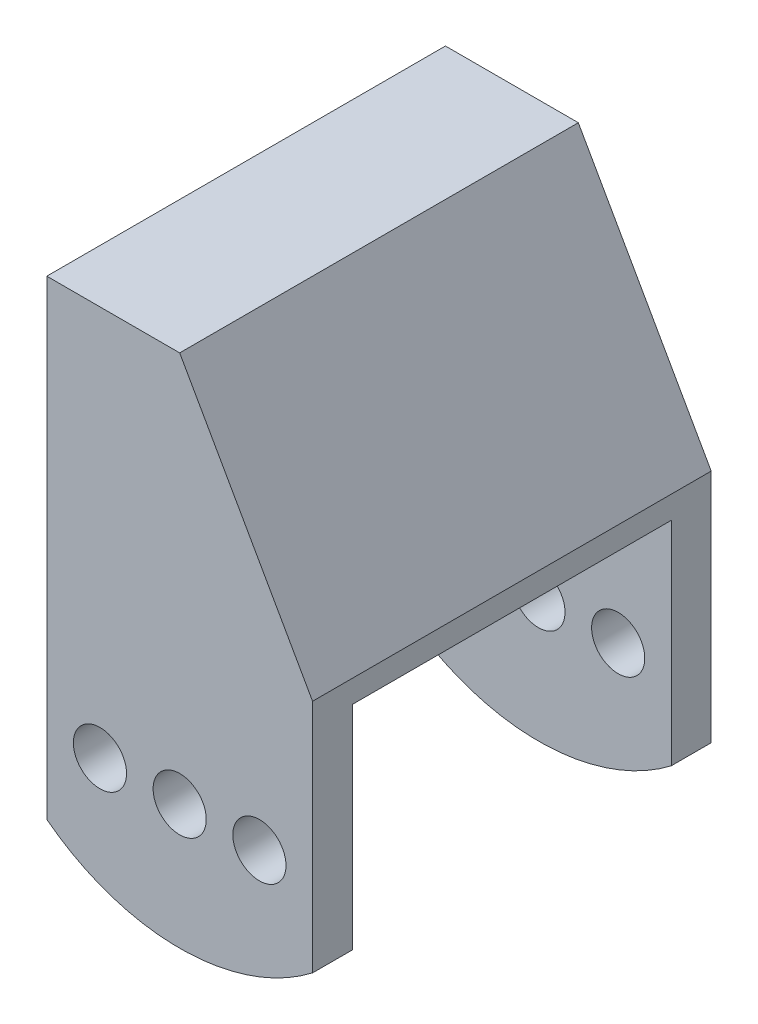
ISO-10303-21;
HEADER;
FILE_DESCRIPTION(('STEP AP214'),'2;1');
FILE_NAME('part.step','',(''),(''),'','','');
FILE_SCHEMA(('AUTOMOTIVE_DESIGN { 1 0 10303 214 1 1 1 1 }'));
ENDSEC;
DATA;
#1=APPLICATION_CONTEXT('core data for automotive mechanical design processes');
#2=APPLICATION_PROTOCOL_DEFINITION('international standard','automotive_design',2000,#1);
#3=PRODUCT_CONTEXT('',#1,'mechanical');
#4=PRODUCT('Part','Part','',(#3));
#5=PRODUCT_RELATED_PRODUCT_CATEGORY('part','',(#4));
#6=PRODUCT_DEFINITION_FORMATION('','',#4);
#7=PRODUCT_DEFINITION_CONTEXT('part definition',#1,'design');
#8=PRODUCT_DEFINITION('design','',#6,#7);
#9=PRODUCT_DEFINITION_SHAPE('','',#8);
#10=(LENGTH_UNIT() NAMED_UNIT(*) SI_UNIT(.MILLI.,.METRE.));
#11=(NAMED_UNIT(*) PLANE_ANGLE_UNIT() SI_UNIT($,.RADIAN.));
#12=(NAMED_UNIT(*) SI_UNIT($,.STERADIAN.) SOLID_ANGLE_UNIT());
#13=UNCERTAINTY_MEASURE_WITH_UNIT(LENGTH_MEASURE(1.E-05),#10,'distance_accuracy_value','');
#14=(GEOMETRIC_REPRESENTATION_CONTEXT(3) GLOBAL_UNCERTAINTY_ASSIGNED_CONTEXT((#13)) GLOBAL_UNIT_ASSIGNED_CONTEXT((#10,
#11,#12)) REPRESENTATION_CONTEXT('',''));
#15=CARTESIAN_POINT('',(0.,0.,0.));
#16=DIRECTION('',(0.,0.,1.));
#17=DIRECTION('',(1.,0.,0.));
#18=AXIS2_PLACEMENT_3D('',#15,#16,#17);
#19=CARTESIAN_POINT('',(0.,0.,30.));
#20=DIRECTION('',(0.,0.,-1.));
#21=DIRECTION('',(-1.,0.,0.));
#22=AXIS2_PLACEMENT_3D('',#19,#20,#21);
#23=CYLINDRICAL_SURFACE('',#22,16.4267963170458);
#24=DIRECTION('',(0.,0.,-1.));
#25=VECTOR('',#24,1.);
#26=CARTESIAN_POINT('',(10.,-13.032253728412,30.));
#27=LINE('',#26,#25);
#28=CARTESIAN_POINT('',(10.,-13.032253728412,3.));
#29=VERTEX_POINT('',#28);
#30=CARTESIAN_POINT('',(10.,-13.032253728412,0.));
#31=VERTEX_POINT('',#30);
#32=EDGE_CURVE('E144',#29,#31,#27,.T.);
#33=ORIENTED_EDGE('',*,*,#32,.F.);
#34=CARTESIAN_POINT('',(0.,0.,3.));
#35=DIRECTION('',(0.,0.,-1.));
#36=DIRECTION('',(-1.,0.,0.));
#37=AXIS2_PLACEMENT_3D('',#34,#35,#36);
#38=CIRCLE('',#37,16.4267963170458);
#39=CARTESIAN_POINT('',(-10.,-13.032253728412,3.));
#40=VERTEX_POINT('',#39);
#41=EDGE_CURVE('E54',#29,#40,#38,.T.);
#42=ORIENTED_EDGE('',*,*,#41,.T.);
#43=DIRECTION('',(0.,0.,-1.));
#44=VECTOR('',#43,1.);
#45=CARTESIAN_POINT('',(-10.,-13.032253728412,30.));
#46=LINE('',#45,#44);
#47=CARTESIAN_POINT('',(-10.,-13.032253728412,0.));
#48=VERTEX_POINT('',#47);
#49=EDGE_CURVE('E119',#40,#48,#46,.T.);
#50=ORIENTED_EDGE('',*,*,#49,.T.);
#51=CARTESIAN_POINT('',(0.,0.,0.));
#52=DIRECTION('',(0.,0.,1.));
#53=DIRECTION('',(1.,0.,0.));
#54=AXIS2_PLACEMENT_3D('',#51,#52,#53);
#55=CIRCLE('',#54,16.4267963170458);
#56=EDGE_CURVE('E138',#48,#31,#55,.T.);
#57=ORIENTED_EDGE('',*,*,#56,.T.);
#58=EDGE_LOOP('',(#33,#42,#50,#57));
#59=FACE_BOUND('',#58,.T.);
#60=ADVANCED_FACE('F37',(#59),#23,.T.);
#61=CARTESIAN_POINT('',(0.,-7.03225372841202,30.));
#62=DIRECTION('',(0.,0.,-1.));
#63=DIRECTION('',(-1.,0.,0.));
#64=AXIS2_PLACEMENT_3D('',#61,#62,#63);
#65=CYLINDRICAL_SURFACE('',#64,2.);
#66=CARTESIAN_POINT('',(0.,-7.03225372841202,27.));
#67=DIRECTION('',(0.,0.,1.));
#68=DIRECTION('',(1.,0.,0.));
#69=AXIS2_PLACEMENT_3D('',#66,#67,#68);
#70=CIRCLE('',#69,2.);
#71=CARTESIAN_POINT('',(2.,-7.03225372841202,27.));
#72=VERTEX_POINT('',#71);
#73=EDGE_CURVE('E176',#72,#72,#70,.T.);
#74=ORIENTED_EDGE('',*,*,#73,.F.);
#75=EDGE_LOOP('',(#74));
#76=FACE_BOUND('',#75,.T.);
#77=CARTESIAN_POINT('',(0.,-7.03225372841202,30.));
#78=DIRECTION('',(0.,0.,1.));
#79=DIRECTION('',(1.,0.,0.));
#80=AXIS2_PLACEMENT_3D('',#77,#78,#79);
#81=CIRCLE('',#80,2.);
#82=CARTESIAN_POINT('',(2.,-7.03225372841202,30.));
#83=VERTEX_POINT('',#82);
#84=EDGE_CURVE('E133',#83,#83,#81,.T.);
#85=ORIENTED_EDGE('',*,*,#84,.T.);
#86=EDGE_LOOP('',(#85));
#87=FACE_BOUND('',#86,.T.);
#88=ADVANCED_FACE('F307',(#76,#87),#65,.F.);
#89=CARTESIAN_POINT('',(6.,-7.03225372841202,30.));
#90=DIRECTION('',(0.,0.,-1.));
#91=DIRECTION('',(-1.,0.,0.));
#92=AXIS2_PLACEMENT_3D('',#89,#90,#91);
#93=CYLINDRICAL_SURFACE('',#92,2.);
#94=CARTESIAN_POINT('',(6.,-7.03225372841202,27.));
#95=DIRECTION('',(0.,0.,1.));
#96=DIRECTION('',(1.,0.,0.));
#97=AXIS2_PLACEMENT_3D('',#94,#95,#96);
#98=CIRCLE('',#97,2.);
#99=CARTESIAN_POINT('',(8.,-7.03225372841202,27.));
#100=VERTEX_POINT('',#99);
#101=EDGE_CURVE('E173',#100,#100,#98,.T.);
#102=ORIENTED_EDGE('',*,*,#101,.F.);
#103=EDGE_LOOP('',(#102));
#104=FACE_BOUND('',#103,.T.);
#105=CARTESIAN_POINT('',(6.,-7.03225372841202,30.));
#106=DIRECTION('',(0.,0.,1.));
#107=DIRECTION('',(1.,0.,0.));
#108=AXIS2_PLACEMENT_3D('',#105,#106,#107);
#109=CIRCLE('',#108,2.);
#110=CARTESIAN_POINT('',(8.,-7.03225372841202,30.));
#111=VERTEX_POINT('',#110);
#112=EDGE_CURVE('E188',#111,#111,#109,.T.);
#113=ORIENTED_EDGE('',*,*,#112,.T.);
#114=EDGE_LOOP('',(#113));
#115=FACE_BOUND('',#114,.T.);
#116=ADVANCED_FACE('F311',(#104,#115),#93,.F.);
#117=CARTESIAN_POINT('',(-6.,-7.03225372841202,30.));
#118=DIRECTION('',(0.,0.,-1.));
#119=DIRECTION('',(-1.,0.,0.));
#120=AXIS2_PLACEMENT_3D('',#117,#118,#119);
#121=CYLINDRICAL_SURFACE('',#120,2.);
#122=CARTESIAN_POINT('',(-6.,-7.03225372841202,27.));
#123=DIRECTION('',(0.,0.,1.));
#124=DIRECTION('',(1.,0.,0.));
#125=AXIS2_PLACEMENT_3D('',#122,#123,#124);
#126=CIRCLE('',#125,2.);
#127=CARTESIAN_POINT('',(-4.,-7.03225372841202,27.));
#128=VERTEX_POINT('',#127);
#129=EDGE_CURVE('E41',#128,#128,#126,.T.);
#130=ORIENTED_EDGE('',*,*,#129,.F.);
#131=EDGE_LOOP('',(#130));
#132=FACE_BOUND('',#131,.T.);
#133=CARTESIAN_POINT('',(-6.,-7.03225372841202,30.));
#134=DIRECTION('',(0.,0.,1.));
#135=DIRECTION('',(1.,0.,0.));
#136=AXIS2_PLACEMENT_3D('',#133,#134,#135);
#137=CIRCLE('',#136,2.);
#138=CARTESIAN_POINT('',(-4.,-7.03225372841202,30.));
#139=VERTEX_POINT('',#138);
#140=EDGE_CURVE('E182',#139,#139,#137,.T.);
#141=ORIENTED_EDGE('',*,*,#140,.T.);
#142=EDGE_LOOP('',(#141));
#143=FACE_BOUND('',#142,.T.);
#144=ADVANCED_FACE('F321',(#132,#143),#121,.F.);
#145=CARTESIAN_POINT('',(0.,0.,30.));
#146=DIRECTION('',(0.,0.,1.));
#147=DIRECTION('',(1.,0.,0.));
#148=AXIS2_PLACEMENT_3D('',#145,#146,#147);
#149=PLANE('',#148);
#150=ORIENTED_EDGE('',*,*,#112,.F.);
#151=EDGE_LOOP('',(#150));
#152=FACE_BOUND('',#151,.T.);
#153=DIRECTION('',(-0.491789849149758,0.870713927919646,0.));
#154=VECTOR('',#153,1.);
#155=CARTESIAN_POINT('',(0.,22.377746271588,30.));
#156=LINE('',#155,#154);
#157=CARTESIAN_POINT('',(10.,4.67274627158798,30.));
#158=VERTEX_POINT('',#157);
#159=CARTESIAN_POINT('',(0.,22.377746271588,30.));
#160=VERTEX_POINT('',#159);
#161=EDGE_CURVE('E142',#158,#160,#156,.T.);
#162=ORIENTED_EDGE('',*,*,#161,.T.);
#163=DIRECTION('',(-1.,0.,0.));
#164=VECTOR('',#163,1.);
#165=CARTESIAN_POINT('',(-10.,22.377746271588,30.));
#166=LINE('',#165,#164);
#167=CARTESIAN_POINT('',(-10.,22.377746271588,30.));
#168=VERTEX_POINT('',#167);
#169=EDGE_CURVE('E94',#160,#168,#166,.T.);
#170=ORIENTED_EDGE('',*,*,#169,.T.);
#171=DIRECTION('',(0.,-1.,0.));
#172=VECTOR('',#171,1.);
#173=CARTESIAN_POINT('',(-10.,-13.032253728412,30.));
#174=LINE('',#173,#172);
#175=CARTESIAN_POINT('',(-10.,-13.032253728412,30.));
#176=VERTEX_POINT('',#175);
#177=EDGE_CURVE('E100',#168,#176,#174,.T.);
#178=ORIENTED_EDGE('',*,*,#177,.T.);
#179=CARTESIAN_POINT('',(0.,0.,30.));
#180=DIRECTION('',(0.,0.,1.));
#181=DIRECTION('',(1.,0.,0.));
#182=AXIS2_PLACEMENT_3D('',#179,#180,#181);
#183=CIRCLE('',#182,16.4267963170458);
#184=CARTESIAN_POINT('',(10.,-13.032253728412,30.));
#185=VERTEX_POINT('',#184);
#186=EDGE_CURVE('E105',#176,#185,#183,.T.);
#187=ORIENTED_EDGE('',*,*,#186,.T.);
#188=DIRECTION('',(0.,1.,0.));
#189=VECTOR('',#188,1.);
#190=CARTESIAN_POINT('',(10.,4.67274627158798,30.));
#191=LINE('',#190,#189);
#192=EDGE_CURVE('E63',#185,#158,#191,.T.);
#193=ORIENTED_EDGE('',*,*,#192,.T.);
#194=EDGE_LOOP('',(#162,#170,#178,#187,#193));
#195=FACE_BOUND('',#194,.T.);
#196=ORIENTED_EDGE('',*,*,#84,.F.);
#197=EDGE_LOOP('',(#196));
#198=FACE_BOUND('',#197,.T.);
#199=ORIENTED_EDGE('',*,*,#140,.F.);
#200=EDGE_LOOP('',(#199));
#201=FACE_BOUND('',#200,.T.);
#202=ADVANCED_FACE('F102',(#152,#195,#198,#201),#149,.T.);
#203=CARTESIAN_POINT('',(0.,0.,0.));
#204=DIRECTION('',(0.,0.,1.));
#205=DIRECTION('',(1.,0.,0.));
#206=AXIS2_PLACEMENT_3D('',#203,#204,#205);
#207=PLANE('',#206);
#208=DIRECTION('',(-0.491789849149758,0.870713927919646,0.));
#209=VECTOR('',#208,1.);
#210=CARTESIAN_POINT('',(0.,22.377746271588,0.));
#211=LINE('',#210,#209);
#212=CARTESIAN_POINT('',(10.,4.67274627158798,0.));
#213=VERTEX_POINT('',#212);
#214=CARTESIAN_POINT('',(0.,22.377746271588,0.));
#215=VERTEX_POINT('',#214);
#216=EDGE_CURVE('E129',#213,#215,#211,.T.);
#217=ORIENTED_EDGE('',*,*,#216,.F.);
#218=DIRECTION('',(0.,1.,0.));
#219=VECTOR('',#218,1.);
#220=CARTESIAN_POINT('',(10.,4.67274627158798,0.));
#221=LINE('',#220,#219);
#222=EDGE_CURVE('E86',#31,#213,#221,.T.);
#223=ORIENTED_EDGE('',*,*,#222,.F.);
#224=ORIENTED_EDGE('',*,*,#56,.F.);
#225=DIRECTION('',(0.,-1.,0.));
#226=VECTOR('',#225,1.);
#227=CARTESIAN_POINT('',(-10.,-13.032253728412,0.));
#228=LINE('',#227,#226);
#229=CARTESIAN_POINT('',(-10.,22.377746271588,0.));
#230=VERTEX_POINT('',#229);
#231=EDGE_CURVE('E135',#230,#48,#228,.T.);
#232=ORIENTED_EDGE('',*,*,#231,.F.);
#233=DIRECTION('',(-1.,0.,0.));
#234=VECTOR('',#233,1.);
#235=CARTESIAN_POINT('',(-10.,22.377746271588,0.));
#236=LINE('',#235,#234);
#237=EDGE_CURVE('E132',#215,#230,#236,.T.);
#238=ORIENTED_EDGE('',*,*,#237,.F.);
#239=EDGE_LOOP('',(#217,#223,#224,#232,#238));
#240=FACE_BOUND('',#239,.T.);
#241=CARTESIAN_POINT('',(0.,-7.03225372841202,0.));
#242=DIRECTION('',(0.,0.,1.));
#243=DIRECTION('',(1.,0.,0.));
#244=AXIS2_PLACEMENT_3D('',#241,#242,#243);
#245=CIRCLE('',#244,2.);
#246=CARTESIAN_POINT('',(2.,-7.03225372841202,0.));
#247=VERTEX_POINT('',#246);
#248=EDGE_CURVE('E191',#247,#247,#245,.T.);
#249=ORIENTED_EDGE('',*,*,#248,.T.);
#250=EDGE_LOOP('',(#249));
#251=FACE_BOUND('',#250,.T.);
#252=CARTESIAN_POINT('',(6.,-7.03225372841202,0.));
#253=DIRECTION('',(0.,0.,1.));
#254=DIRECTION('',(1.,0.,0.));
#255=AXIS2_PLACEMENT_3D('',#252,#253,#254);
#256=CIRCLE('',#255,2.);
#257=CARTESIAN_POINT('',(8.,-7.03225372841202,0.));
#258=VERTEX_POINT('',#257);
#259=EDGE_CURVE('E185',#258,#258,#256,.T.);
#260=ORIENTED_EDGE('',*,*,#259,.T.);
#261=EDGE_LOOP('',(#260));
#262=FACE_BOUND('',#261,.T.);
#263=CARTESIAN_POINT('',(-6.,-7.03225372841202,0.));
#264=DIRECTION('',(0.,0.,1.));
#265=DIRECTION('',(1.,0.,0.));
#266=AXIS2_PLACEMENT_3D('',#263,#264,#265);
#267=CIRCLE('',#266,2.);
#268=CARTESIAN_POINT('',(-4.,-7.03225372841202,0.));
#269=VERTEX_POINT('',#268);
#270=EDGE_CURVE('E181',#269,#269,#267,.T.);
#271=ORIENTED_EDGE('',*,*,#270,.T.);
#272=EDGE_LOOP('',(#271));
#273=FACE_BOUND('',#272,.T.);
#274=ADVANCED_FACE('F207',(#240,#251,#262,#273),#207,.F.);
#275=CARTESIAN_POINT('',(0.,22.377746271588,30.));
#276=DIRECTION('',(-0.870713927919646,-0.491789849149758,0.));
#277=DIRECTION('',(0.491789849149758,-0.870713927919646,0.));
#278=AXIS2_PLACEMENT_3D('',#275,#276,#277);
#279=PLANE('',#278);
#280=ORIENTED_EDGE('',*,*,#216,.T.);
#281=DIRECTION('',(0.,0.,-1.));
#282=VECTOR('',#281,1.);
#283=CARTESIAN_POINT('',(0.,22.377746271588,30.));
#284=LINE('',#283,#282);
#285=EDGE_CURVE('E11',#160,#215,#284,.T.);
#286=ORIENTED_EDGE('',*,*,#285,.F.);
#287=ORIENTED_EDGE('',*,*,#161,.F.);
#288=DIRECTION('',(0.,0.,-1.));
#289=VECTOR('',#288,1.);
#290=CARTESIAN_POINT('',(10.,4.67274627158798,30.));
#291=LINE('',#290,#289);
#292=EDGE_CURVE('E125',#158,#213,#291,.T.);
#293=ORIENTED_EDGE('',*,*,#292,.T.);
#294=EDGE_LOOP('',(#280,#286,#287,#293));
#295=FACE_BOUND('',#294,.T.);
#296=ADVANCED_FACE('F39',(#295),#279,.F.);
#297=CARTESIAN_POINT('',(-10.,22.377746271588,30.));
#298=DIRECTION('',(0.,-1.,0.));
#299=DIRECTION('',(0.,0.,-1.));
#300=AXIS2_PLACEMENT_3D('',#297,#298,#299);
#301=PLANE('',#300);
#302=ORIENTED_EDGE('',*,*,#237,.T.);
#303=DIRECTION('',(0.,0.,-1.));
#304=VECTOR('',#303,1.);
#305=CARTESIAN_POINT('',(-10.,22.377746271588,30.));
#306=LINE('',#305,#304);
#307=EDGE_CURVE('E46',#168,#230,#306,.T.);
#308=ORIENTED_EDGE('',*,*,#307,.F.);
#309=ORIENTED_EDGE('',*,*,#169,.F.);
#310=ORIENTED_EDGE('',*,*,#285,.T.);
#311=EDGE_LOOP('',(#302,#308,#309,#310));
#312=FACE_BOUND('',#311,.T.);
#313=ADVANCED_FACE('F202',(#312),#301,.F.);
#314=CARTESIAN_POINT('',(-10.,-13.032253728412,30.));
#315=DIRECTION('',(1.,0.,0.));
#316=DIRECTION('',(0.,0.,-1.));
#317=AXIS2_PLACEMENT_3D('',#314,#315,#316);
#318=PLANE('',#317);
#319=CARTESIAN_POINT('',(-10.,12.967746271588,15.));
#320=DIRECTION('',(-1.,0.,0.));
#321=DIRECTION('',(0.,0.,1.));
#322=AXIS2_PLACEMENT_3D('',#319,#320,#321);
#323=CIRCLE('',#322,8.90000000000001);
#324=CARTESIAN_POINT('',(-10.,12.967746271588,23.9));
#325=VERTEX_POINT('',#324);
#326=EDGE_CURVE('E238',#325,#325,#323,.T.);
#327=ORIENTED_EDGE('',*,*,#326,.F.);
#328=EDGE_LOOP('',(#327));
#329=FACE_BOUND('',#328,.T.);
#330=DIRECTION('',(0.,0.,1.));
#331=VECTOR('',#330,1.);
#332=CARTESIAN_POINT('',(-10.,2.96774627158798,27.));
#333=LINE('',#332,#331);
#334=CARTESIAN_POINT('',(-10.,2.96774627158798,3.));
#335=VERTEX_POINT('',#334);
#336=CARTESIAN_POINT('',(-10.,2.96774627158798,27.));
#337=VERTEX_POINT('',#336);
#338=EDGE_CURVE('E164',#335,#337,#333,.T.);
#339=ORIENTED_EDGE('',*,*,#338,.T.);
#340=DIRECTION('',(0.,-1.,0.));
#341=VECTOR('',#340,1.);
#342=CARTESIAN_POINT('',(-10.,-16.4267963170458,27.));
#343=LINE('',#342,#341);
#344=CARTESIAN_POINT('',(-10.,-13.032253728412,27.));
#345=VERTEX_POINT('',#344);
#346=EDGE_CURVE('E116',#337,#345,#343,.T.);
#347=ORIENTED_EDGE('',*,*,#346,.T.);
#348=EDGE_CURVE('E112',#176,#345,#46,.T.);
#349=ORIENTED_EDGE('',*,*,#348,.F.);
#350=ORIENTED_EDGE('',*,*,#177,.F.);
#351=ORIENTED_EDGE('',*,*,#307,.T.);
#352=ORIENTED_EDGE('',*,*,#231,.T.);
#353=ORIENTED_EDGE('',*,*,#49,.F.);
#354=DIRECTION('',(0.,1.,0.));
#355=VECTOR('',#354,1.);
#356=CARTESIAN_POINT('',(-10.,-16.4267963170458,3.));
#357=LINE('',#356,#355);
#358=EDGE_CURVE('E214',#40,#335,#357,.T.);
#359=ORIENTED_EDGE('',*,*,#358,.T.);
#360=EDGE_LOOP('',(#339,#347,#349,#350,#351,#352,#353,#359));
#361=FACE_BOUND('',#360,.T.);
#362=ADVANCED_FACE('F114',(#329,#361),#318,.F.);
#363=ORIENTED_EDGE('',*,*,#348,.T.);
#364=CARTESIAN_POINT('',(0.,0.,27.));
#365=DIRECTION('',(0.,0.,1.));
#366=DIRECTION('',(1.,0.,0.));
#367=AXIS2_PLACEMENT_3D('',#364,#365,#366);
#368=CIRCLE('',#367,16.4267963170458);
#369=CARTESIAN_POINT('',(10.,-13.032253728412,27.));
#370=VERTEX_POINT('',#369);
#371=EDGE_CURVE('E179',#345,#370,#368,.T.);
#372=ORIENTED_EDGE('',*,*,#371,.T.);
#373=EDGE_CURVE('E123',#185,#370,#27,.T.);
#374=ORIENTED_EDGE('',*,*,#373,.F.);
#375=ORIENTED_EDGE('',*,*,#186,.F.);
#376=EDGE_LOOP('',(#363,#372,#374,#375));
#377=FACE_BOUND('',#376,.T.);
#378=ADVANCED_FACE('F121',(#377),#23,.T.);
#379=CARTESIAN_POINT('',(10.,4.67274627158798,30.));
#380=DIRECTION('',(-1.,0.,0.));
#381=DIRECTION('',(0.,0.,1.));
#382=AXIS2_PLACEMENT_3D('',#379,#380,#381);
#383=PLANE('',#382);
#384=ORIENTED_EDGE('',*,*,#373,.T.);
#385=DIRECTION('',(0.,-1.,0.));
#386=VECTOR('',#385,1.);
#387=CARTESIAN_POINT('',(10.,-16.4267963170458,27.));
#388=LINE('',#387,#386);
#389=CARTESIAN_POINT('',(10.,2.96774627158798,27.));
#390=VERTEX_POINT('',#389);
#391=EDGE_CURVE('E234',#390,#370,#388,.T.);
#392=ORIENTED_EDGE('',*,*,#391,.F.);
#393=DIRECTION('',(0.,0.,1.));
#394=VECTOR('',#393,1.);
#395=CARTESIAN_POINT('',(10.,2.96774627158798,27.));
#396=LINE('',#395,#394);
#397=CARTESIAN_POINT('',(10.,2.96774627158798,3.));
#398=VERTEX_POINT('',#397);
#399=EDGE_CURVE('E167',#398,#390,#396,.T.);
#400=ORIENTED_EDGE('',*,*,#399,.F.);
#401=DIRECTION('',(0.,1.,0.));
#402=VECTOR('',#401,1.);
#403=CARTESIAN_POINT('',(10.,-16.4267963170458,3.));
#404=LINE('',#403,#402);
#405=EDGE_CURVE('E226',#29,#398,#404,.T.);
#406=ORIENTED_EDGE('',*,*,#405,.F.);
#407=ORIENTED_EDGE('',*,*,#32,.T.);
#408=ORIENTED_EDGE('',*,*,#222,.T.);
#409=ORIENTED_EDGE('',*,*,#292,.F.);
#410=ORIENTED_EDGE('',*,*,#192,.F.);
#411=EDGE_LOOP('',(#384,#392,#400,#406,#407,#408,#409,#410));
#412=FACE_BOUND('',#411,.T.);
#413=ADVANCED_FACE('F298',(#412),#383,.F.);
#414=CARTESIAN_POINT('',(0.,-7.03225372841202,3.));
#415=DIRECTION('',(0.,0.,-1.));
#416=DIRECTION('',(-1.,0.,0.));
#417=AXIS2_PLACEMENT_3D('',#414,#415,#416);
#418=CIRCLE('',#417,2.);
#419=CARTESIAN_POINT('',(-2.,-7.03225372841202,3.));
#420=VERTEX_POINT('',#419);
#421=EDGE_CURVE('E153',#420,#420,#418,.T.);
#422=ORIENTED_EDGE('',*,*,#421,.F.);
#423=EDGE_LOOP('',(#422));
#424=FACE_BOUND('',#423,.T.);
#425=ORIENTED_EDGE('',*,*,#248,.F.);
#426=EDGE_LOOP('',(#425));
#427=FACE_BOUND('',#426,.T.);
#428=ADVANCED_FACE('F314',(#424,#427),#65,.F.);
#429=CARTESIAN_POINT('',(6.,-7.03225372841202,3.));
#430=DIRECTION('',(0.,0.,-1.));
#431=DIRECTION('',(-1.,0.,0.));
#432=AXIS2_PLACEMENT_3D('',#429,#430,#431);
#433=CIRCLE('',#432,2.);
#434=CARTESIAN_POINT('',(4.,-7.03225372841202,3.));
#435=VERTEX_POINT('',#434);
#436=EDGE_CURVE('E148',#435,#435,#433,.T.);
#437=ORIENTED_EDGE('',*,*,#436,.F.);
#438=EDGE_LOOP('',(#437));
#439=FACE_BOUND('',#438,.T.);
#440=ORIENTED_EDGE('',*,*,#259,.F.);
#441=EDGE_LOOP('',(#440));
#442=FACE_BOUND('',#441,.T.);
#443=ADVANCED_FACE('F325',(#439,#442),#93,.F.);
#444=CARTESIAN_POINT('',(-6.,-7.03225372841202,3.));
#445=DIRECTION('',(0.,0.,-1.));
#446=DIRECTION('',(-1.,0.,0.));
#447=AXIS2_PLACEMENT_3D('',#444,#445,#446);
#448=CIRCLE('',#447,2.);
#449=CARTESIAN_POINT('',(-8.,-7.03225372841202,3.));
#450=VERTEX_POINT('',#449);
#451=EDGE_CURVE('E146',#450,#450,#448,.T.);
#452=ORIENTED_EDGE('',*,*,#451,.F.);
#453=EDGE_LOOP('',(#452));
#454=FACE_BOUND('',#453,.T.);
#455=ORIENTED_EDGE('',*,*,#270,.F.);
#456=EDGE_LOOP('',(#455));
#457=FACE_BOUND('',#456,.T.);
#458=ADVANCED_FACE('F329',(#454,#457),#121,.F.);
#459=CARTESIAN_POINT('',(-10.,-16.4267963170458,27.));
#460=DIRECTION('',(0.,0.,1.));
#461=DIRECTION('',(1.,0.,0.));
#462=AXIS2_PLACEMENT_3D('',#459,#460,#461);
#463=PLANE('',#462);
#464=ORIENTED_EDGE('',*,*,#73,.T.);
#465=EDGE_LOOP('',(#464));
#466=FACE_BOUND('',#465,.T.);
#467=ORIENTED_EDGE('',*,*,#101,.T.);
#468=EDGE_LOOP('',(#467));
#469=FACE_BOUND('',#468,.T.);
#470=ORIENTED_EDGE('',*,*,#129,.T.);
#471=EDGE_LOOP('',(#470));
#472=FACE_BOUND('',#471,.T.);
#473=ORIENTED_EDGE('',*,*,#346,.F.);
#474=DIRECTION('',(1.,0.,0.));
#475=VECTOR('',#474,1.);
#476=CARTESIAN_POINT('',(-10.,2.96774627158798,27.));
#477=LINE('',#476,#475);
#478=EDGE_CURVE('E149',#337,#390,#477,.T.);
#479=ORIENTED_EDGE('',*,*,#478,.T.);
#480=ORIENTED_EDGE('',*,*,#391,.T.);
#481=ORIENTED_EDGE('',*,*,#371,.F.);
#482=EDGE_LOOP('',(#473,#479,#480,#481));
#483=FACE_BOUND('',#482,.T.);
#484=ADVANCED_FACE('F333',(#466,#469,#472,#483),#463,.F.);
#485=CARTESIAN_POINT('',(-10.,-16.4267963170458,3.));
#486=DIRECTION('',(0.,0.,-1.));
#487=DIRECTION('',(-1.,0.,0.));
#488=AXIS2_PLACEMENT_3D('',#485,#486,#487);
#489=PLANE('',#488);
#490=ORIENTED_EDGE('',*,*,#421,.T.);
#491=EDGE_LOOP('',(#490));
#492=FACE_BOUND('',#491,.T.);
#493=ORIENTED_EDGE('',*,*,#436,.T.);
#494=EDGE_LOOP('',(#493));
#495=FACE_BOUND('',#494,.T.);
#496=ORIENTED_EDGE('',*,*,#451,.T.);
#497=EDGE_LOOP('',(#496));
#498=FACE_BOUND('',#497,.T.);
#499=ORIENTED_EDGE('',*,*,#405,.T.);
#500=DIRECTION('',(1.,0.,0.));
#501=VECTOR('',#500,1.);
#502=CARTESIAN_POINT('',(-10.,2.96774627158798,3.));
#503=LINE('',#502,#501);
#504=EDGE_CURVE('E156',#335,#398,#503,.T.);
#505=ORIENTED_EDGE('',*,*,#504,.F.);
#506=ORIENTED_EDGE('',*,*,#358,.F.);
#507=ORIENTED_EDGE('',*,*,#41,.F.);
#508=EDGE_LOOP('',(#499,#505,#506,#507));
#509=FACE_BOUND('',#508,.T.);
#510=ADVANCED_FACE('F225',(#492,#495,#498,#509),#489,.F.);
#511=CARTESIAN_POINT('',(-10.,2.96774627158798,27.));
#512=DIRECTION('',(0.,1.,0.));
#513=DIRECTION('',(0.,0.,1.));
#514=AXIS2_PLACEMENT_3D('',#511,#512,#513);
#515=PLANE('',#514);
#516=ORIENTED_EDGE('',*,*,#399,.T.);
#517=ORIENTED_EDGE('',*,*,#478,.F.);
#518=ORIENTED_EDGE('',*,*,#338,.F.);
#519=ORIENTED_EDGE('',*,*,#504,.T.);
#520=EDGE_LOOP('',(#516,#517,#518,#519));
#521=FACE_BOUND('',#520,.T.);
#522=ADVANCED_FACE('F229',(#521),#515,.F.);
#523=CARTESIAN_POINT('',(-7.,12.967746271588,15.));
#524=DIRECTION('',(-1.,0.,0.));
#525=DIRECTION('',(0.,0.,1.));
#526=AXIS2_PLACEMENT_3D('',#523,#524,#525);
#527=CYLINDRICAL_SURFACE('',#526,8.90000000000001);
#528=CARTESIAN_POINT('',(-7.,12.967746271588,15.));
#529=DIRECTION('',(-1.,0.,0.));
#530=DIRECTION('',(0.,0.,1.));
#531=AXIS2_PLACEMENT_3D('',#528,#529,#530);
#532=CIRCLE('',#531,8.90000000000001);
#533=CARTESIAN_POINT('',(-7.,12.967746271588,23.9));
#534=VERTEX_POINT('',#533);
#535=EDGE_CURVE('E235',#534,#534,#532,.T.);
#536=ORIENTED_EDGE('',*,*,#535,.F.);
#537=EDGE_LOOP('',(#536));
#538=FACE_BOUND('',#537,.T.);
#539=ORIENTED_EDGE('',*,*,#326,.T.);
#540=EDGE_LOOP('',(#539));
#541=FACE_BOUND('',#540,.T.);
#542=ADVANCED_FACE('F275',(#538,#541),#527,.F.);
#543=CARTESIAN_POINT('',(-7.,12.967746271588,15.));
#544=DIRECTION('',(-1.,0.,0.));
#545=DIRECTION('',(0.,0.,1.));
#546=AXIS2_PLACEMENT_3D('',#543,#544,#545);
#547=PLANE('',#546);
#548=CARTESIAN_POINT('',(-7.,12.967746271588,21.));
#549=DIRECTION('',(-1.,0.,0.));
#550=DIRECTION('',(0.,0.,1.));
#551=AXIS2_PLACEMENT_3D('',#548,#549,#550);
#552=CIRCLE('',#551,2.);
#553=CARTESIAN_POINT('',(-7.,12.967746271588,23.));
#554=VERTEX_POINT('',#553);
#555=EDGE_CURVE('E259',#554,#554,#552,.T.);
#556=ORIENTED_EDGE('',*,*,#555,.F.);
#557=EDGE_LOOP('',(#556));
#558=FACE_BOUND('',#557,.T.);
#559=CARTESIAN_POINT('',(-7.,12.967746271588,9.));
#560=DIRECTION('',(-1.,0.,0.));
#561=DIRECTION('',(0.,0.,1.));
#562=AXIS2_PLACEMENT_3D('',#559,#560,#561);
#563=CIRCLE('',#562,2.);
#564=CARTESIAN_POINT('',(-7.,12.967746271588,11.));
#565=VERTEX_POINT('',#564);
#566=EDGE_CURVE('E253',#565,#565,#563,.T.);
#567=ORIENTED_EDGE('',*,*,#566,.F.);
#568=EDGE_LOOP('',(#567));
#569=FACE_BOUND('',#568,.T.);
#570=CARTESIAN_POINT('',(-7.,6.96774627158798,15.));
#571=DIRECTION('',(-1.,0.,0.));
#572=DIRECTION('',(0.,0.,1.));
#573=AXIS2_PLACEMENT_3D('',#570,#571,#572);
#574=CIRCLE('',#573,2.);
#575=CARTESIAN_POINT('',(-7.,6.96774627158798,17.));
#576=VERTEX_POINT('',#575);
#577=EDGE_CURVE('E247',#576,#576,#574,.T.);
#578=ORIENTED_EDGE('',*,*,#577,.F.);
#579=EDGE_LOOP('',(#578));
#580=FACE_BOUND('',#579,.T.);
#581=CARTESIAN_POINT('',(-7.,18.967746271588,15.));
#582=DIRECTION('',(-1.,0.,0.));
#583=DIRECTION('',(0.,0.,1.));
#584=AXIS2_PLACEMENT_3D('',#581,#582,#583);
#585=CIRCLE('',#584,2.);
#586=CARTESIAN_POINT('',(-7.,18.967746271588,17.));
#587=VERTEX_POINT('',#586);
#588=EDGE_CURVE('E241',#587,#587,#585,.T.);
#589=ORIENTED_EDGE('',*,*,#588,.F.);
#590=EDGE_LOOP('',(#589));
#591=FACE_BOUND('',#590,.T.);
#592=ORIENTED_EDGE('',*,*,#535,.T.);
#593=EDGE_LOOP('',(#592));
#594=FACE_BOUND('',#593,.T.);
#595=ADVANCED_FACE('F271',(#558,#569,#580,#591,#594),#547,.T.);
#596=CARTESIAN_POINT('',(-7.,18.967746271588,15.));
#597=DIRECTION('',(-1.,0.,0.));
#598=DIRECTION('',(0.,0.,1.));
#599=AXIS2_PLACEMENT_3D('',#596,#597,#598);
#600=CYLINDRICAL_SURFACE('',#599,2.);
#601=ORIENTED_EDGE('',*,*,#588,.T.);
#602=EDGE_LOOP('',(#601));
#603=FACE_BOUND('',#602,.T.);
#604=CARTESIAN_POINT('',(-10.,18.967746271588,15.));
#605=DIRECTION('',(-1.,0.,0.));
#606=DIRECTION('',(0.,0.,1.));
#607=AXIS2_PLACEMENT_3D('',#604,#605,#606);
#608=CIRCLE('',#607,2.);
#609=CARTESIAN_POINT('',(-10.,18.967746271588,17.));
#610=VERTEX_POINT('',#609);
#611=EDGE_CURVE('E244',#610,#610,#608,.T.);
#612=ORIENTED_EDGE('',*,*,#611,.F.);
#613=EDGE_LOOP('',(#612));
#614=FACE_BOUND('',#613,.T.);
#615=ADVANCED_FACE('F274',(#603,#614),#600,.T.);
#616=CARTESIAN_POINT('',(-7.,6.96774627158798,15.));
#617=DIRECTION('',(-1.,0.,0.));
#618=DIRECTION('',(0.,0.,1.));
#619=AXIS2_PLACEMENT_3D('',#616,#617,#618);
#620=CYLINDRICAL_SURFACE('',#619,2.);
#621=ORIENTED_EDGE('',*,*,#577,.T.);
#622=EDGE_LOOP('',(#621));
#623=FACE_BOUND('',#622,.T.);
#624=CARTESIAN_POINT('',(-10.,6.96774627158798,15.));
#625=DIRECTION('',(-1.,0.,0.));
#626=DIRECTION('',(0.,0.,1.));
#627=AXIS2_PLACEMENT_3D('',#624,#625,#626);
#628=CIRCLE('',#627,2.);
#629=CARTESIAN_POINT('',(-10.,6.96774627158798,17.));
#630=VERTEX_POINT('',#629);
#631=EDGE_CURVE('E250',#630,#630,#628,.T.);
#632=ORIENTED_EDGE('',*,*,#631,.F.);
#633=EDGE_LOOP('',(#632));
#634=FACE_BOUND('',#633,.T.);
#635=ADVANCED_FACE('F345',(#623,#634),#620,.T.);
#636=CARTESIAN_POINT('',(-7.,12.967746271588,9.));
#637=DIRECTION('',(-1.,0.,0.));
#638=DIRECTION('',(0.,0.,1.));
#639=AXIS2_PLACEMENT_3D('',#636,#637,#638);
#640=CYLINDRICAL_SURFACE('',#639,2.);
#641=ORIENTED_EDGE('',*,*,#566,.T.);
#642=EDGE_LOOP('',(#641));
#643=FACE_BOUND('',#642,.T.);
#644=CARTESIAN_POINT('',(-10.,12.967746271588,9.));
#645=DIRECTION('',(-1.,0.,0.));
#646=DIRECTION('',(0.,0.,1.));
#647=AXIS2_PLACEMENT_3D('',#644,#645,#646);
#648=CIRCLE('',#647,2.);
#649=CARTESIAN_POINT('',(-10.,12.967746271588,11.));
#650=VERTEX_POINT('',#649);
#651=EDGE_CURVE('E256',#650,#650,#648,.T.);
#652=ORIENTED_EDGE('',*,*,#651,.F.);
#653=EDGE_LOOP('',(#652));
#654=FACE_BOUND('',#653,.T.);
#655=ADVANCED_FACE('F349',(#643,#654),#640,.T.);
#656=CARTESIAN_POINT('',(-7.,12.967746271588,21.));
#657=DIRECTION('',(-1.,0.,0.));
#658=DIRECTION('',(0.,0.,1.));
#659=AXIS2_PLACEMENT_3D('',#656,#657,#658);
#660=CYLINDRICAL_SURFACE('',#659,2.);
#661=ORIENTED_EDGE('',*,*,#555,.T.);
#662=EDGE_LOOP('',(#661));
#663=FACE_BOUND('',#662,.T.);
#664=CARTESIAN_POINT('',(-10.,12.967746271588,21.));
#665=DIRECTION('',(-1.,0.,0.));
#666=DIRECTION('',(0.,0.,1.));
#667=AXIS2_PLACEMENT_3D('',#664,#665,#666);
#668=CIRCLE('',#667,2.);
#669=CARTESIAN_POINT('',(-10.,12.967746271588,23.));
#670=VERTEX_POINT('',#669);
#671=EDGE_CURVE('E262',#670,#670,#668,.T.);
#672=ORIENTED_EDGE('',*,*,#671,.F.);
#673=EDGE_LOOP('',(#672));
#674=FACE_BOUND('',#673,.T.);
#675=ADVANCED_FACE('F268',(#663,#674),#660,.T.);
#676=ORIENTED_EDGE('',*,*,#651,.T.);
#677=EDGE_LOOP('',(#676));
#678=FACE_BOUND('',#677,.T.);
#679=ADVANCED_FACE('F305',(#678),#318,.F.);
#680=ORIENTED_EDGE('',*,*,#631,.T.);
#681=EDGE_LOOP('',(#680));
#682=FACE_BOUND('',#681,.T.);
#683=ADVANCED_FACE('F301',(#682),#318,.F.);
#684=ORIENTED_EDGE('',*,*,#611,.T.);
#685=EDGE_LOOP('',(#684));
#686=FACE_BOUND('',#685,.T.);
#687=ADVANCED_FACE('F292',(#686),#318,.F.);
#688=ORIENTED_EDGE('',*,*,#671,.T.);
#689=EDGE_LOOP('',(#688));
#690=FACE_BOUND('',#689,.T.);
#691=ADVANCED_FACE('F293',(#690),#318,.F.);
#692=CLOSED_SHELL('',(#60,#88,#116,#144,#202,#274,#296,#313,#362,#378,#413,#428,#443,#458,#484,
#510,#522,#542,#595,#615,#635,#655,#675,#679,#683,#687,#691));
#693=MANIFOLD_SOLID_BREP('B2',#692);
#694=ADVANCED_BREP_SHAPE_REPRESENTATION('',(#18,#693),#14);
#695=SHAPE_DEFINITION_REPRESENTATION(#9,#694);
ENDSEC;
END-ISO-10303-21;
